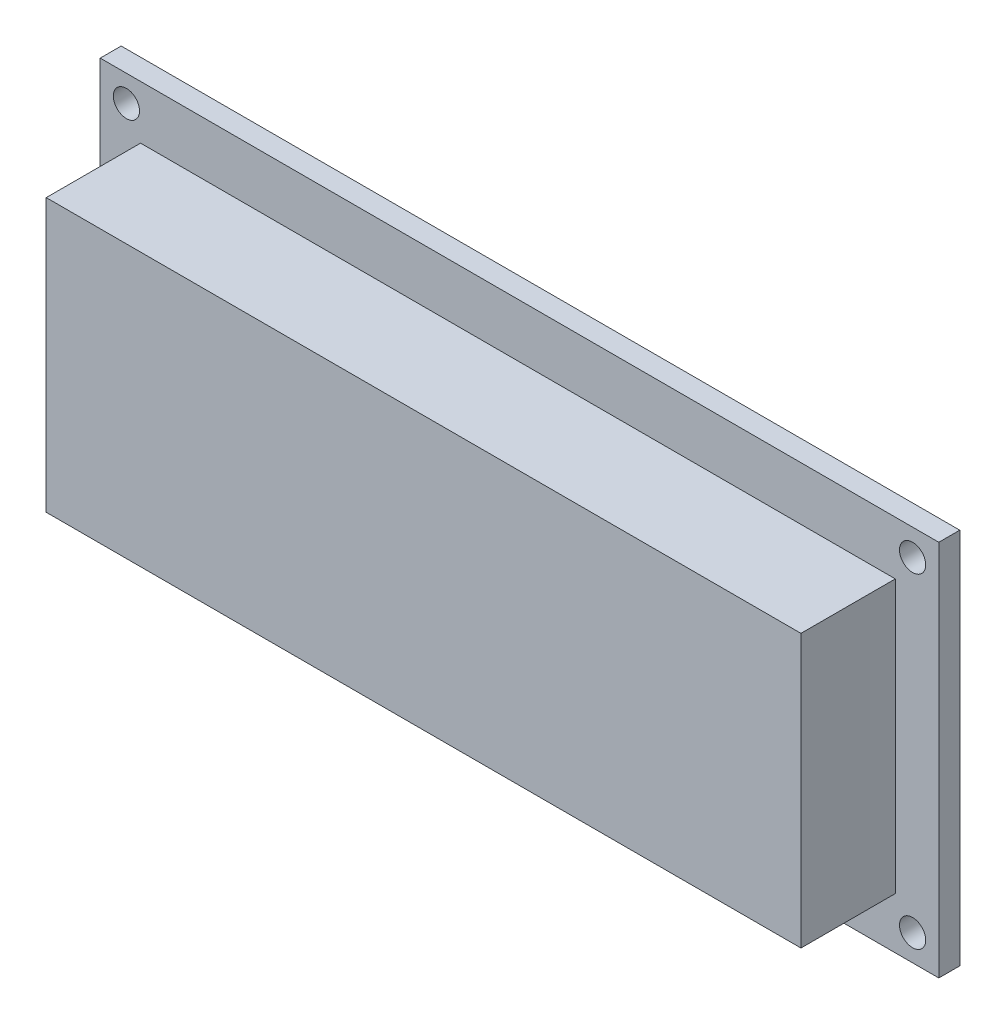
ISO-10303-21;
HEADER;
FILE_DESCRIPTION(('STEP AP214'),'2;1');
FILE_NAME('part.step','',(''),(''),'','','');
FILE_SCHEMA(('AUTOMOTIVE_DESIGN { 1 0 10303 214 1 1 1 1 }'));
ENDSEC;
DATA;
#1=APPLICATION_CONTEXT('core data for automotive mechanical design processes');
#2=APPLICATION_PROTOCOL_DEFINITION('international standard','automotive_design',2000,#1);
#3=PRODUCT_CONTEXT('',#1,'mechanical');
#4=PRODUCT('Part','Part','',(#3));
#5=PRODUCT_RELATED_PRODUCT_CATEGORY('part','',(#4));
#6=PRODUCT_DEFINITION_FORMATION('','',#4);
#7=PRODUCT_DEFINITION_CONTEXT('part definition',#1,'design');
#8=PRODUCT_DEFINITION('design','',#6,#7);
#9=PRODUCT_DEFINITION_SHAPE('','',#8);
#10=(LENGTH_UNIT() NAMED_UNIT(*) SI_UNIT(.MILLI.,.METRE.));
#11=(NAMED_UNIT(*) PLANE_ANGLE_UNIT() SI_UNIT($,.RADIAN.));
#12=(NAMED_UNIT(*) SI_UNIT($,.STERADIAN.) SOLID_ANGLE_UNIT());
#13=UNCERTAINTY_MEASURE_WITH_UNIT(LENGTH_MEASURE(1.E-05),#10,'distance_accuracy_value','');
#14=(GEOMETRIC_REPRESENTATION_CONTEXT(3) GLOBAL_UNCERTAINTY_ASSIGNED_CONTEXT((#13)) GLOBAL_UNIT_ASSIGNED_CONTEXT((#10,
#11,#12)) REPRESENTATION_CONTEXT('',''));
#15=CARTESIAN_POINT('',(0.,0.,0.));
#16=DIRECTION('',(0.,0.,1.));
#17=DIRECTION('',(1.,0.,0.));
#18=AXIS2_PLACEMENT_3D('',#15,#16,#17);
#19=CARTESIAN_POINT('',(0.,0.,2.));
#20=DIRECTION('',(0.,0.,1.));
#21=DIRECTION('',(1.,0.,0.));
#22=AXIS2_PLACEMENT_3D('',#19,#20,#21);
#23=PLANE('',#22);
#24=CARTESIAN_POINT('',(-16.2452195315885,-19.87522160074,2.));
#25=DIRECTION('',(0.,0.,1.));
#26=DIRECTION('',(1.,0.,0.));
#27=AXIS2_PLACEMENT_3D('',#24,#25,#26);
#28=CIRCLE('',#27,1.25);
#29=CARTESIAN_POINT('',(-14.9952195315885,-19.87522160074,2.));
#30=VERTEX_POINT('',#29);
#31=EDGE_CURVE('E222',#30,#30,#28,.T.);
#32=ORIENTED_EDGE('',*,*,#31,.F.);
#33=EDGE_LOOP('',(#32));
#34=FACE_BOUND('',#33,.T.);
#35=CARTESIAN_POINT('',(58.7547804684115,-19.87522160074,2.));
#36=DIRECTION('',(0.,0.,1.));
#37=DIRECTION('',(1.,0.,0.));
#38=AXIS2_PLACEMENT_3D('',#35,#36,#37);
#39=CIRCLE('',#38,1.25);
#40=CARTESIAN_POINT('',(60.0047804684115,-19.87522160074,2.));
#41=VERTEX_POINT('',#40);
#42=EDGE_CURVE('E224',#41,#41,#39,.T.);
#43=ORIENTED_EDGE('',*,*,#42,.F.);
#44=EDGE_LOOP('',(#43));
#45=FACE_BOUND('',#44,.T.);
#46=CARTESIAN_POINT('',(58.7547804684115,11.12477839926,2.));
#47=DIRECTION('',(0.,0.,1.));
#48=DIRECTION('',(1.,0.,0.));
#49=AXIS2_PLACEMENT_3D('',#46,#47,#48);
#50=CIRCLE('',#49,1.25);
#51=CARTESIAN_POINT('',(60.0047804684115,11.12477839926,2.));
#52=VERTEX_POINT('',#51);
#53=EDGE_CURVE('E230',#52,#52,#50,.T.);
#54=ORIENTED_EDGE('',*,*,#53,.F.);
#55=EDGE_LOOP('',(#54));
#56=FACE_BOUND('',#55,.T.);
#57=CARTESIAN_POINT('',(-16.2452195315885,11.12477839926,2.));
#58=DIRECTION('',(0.,0.,1.));
#59=DIRECTION('',(1.,0.,0.));
#60=AXIS2_PLACEMENT_3D('',#57,#58,#59);
#61=CIRCLE('',#60,1.25);
#62=CARTESIAN_POINT('',(-14.9952195315885,11.12477839926,2.));
#63=VERTEX_POINT('',#62);
#64=EDGE_CURVE('E236',#63,#63,#61,.T.);
#65=ORIENTED_EDGE('',*,*,#64,.F.);
#66=EDGE_LOOP('',(#65));
#67=FACE_BOUND('',#66,.T.);
#68=DIRECTION('',(0.,-1.,0.));
#69=VECTOR('',#68,1.);
#70=CARTESIAN_POINT('',(-18.7452195315885,13.62477839926,2.));
#71=LINE('',#70,#69);
#72=CARTESIAN_POINT('',(-18.7452195315885,13.62477839926,2.));
#73=VERTEX_POINT('',#72);
#74=CARTESIAN_POINT('',(-18.7452195315885,-22.37522160074,2.));
#75=VERTEX_POINT('',#74);
#76=EDGE_CURVE('E142',#73,#75,#71,.T.);
#77=ORIENTED_EDGE('',*,*,#76,.T.);
#78=DIRECTION('',(1.,0.,0.));
#79=VECTOR('',#78,1.);
#80=CARTESIAN_POINT('',(-18.7452195315885,-22.37522160074,2.));
#81=LINE('',#80,#79);
#82=CARTESIAN_POINT('',(61.2547804684115,-22.37522160074,2.));
#83=VERTEX_POINT('',#82);
#84=EDGE_CURVE('E87',#75,#83,#81,.T.);
#85=ORIENTED_EDGE('',*,*,#84,.T.);
#86=DIRECTION('',(0.,1.,0.));
#87=VECTOR('',#86,1.);
#88=CARTESIAN_POINT('',(61.2547804684115,13.62477839926,2.));
#89=LINE('',#88,#87);
#90=CARTESIAN_POINT('',(61.2547804684115,13.62477839926,2.));
#91=VERTEX_POINT('',#90);
#92=EDGE_CURVE('E145',#83,#91,#89,.T.);
#93=ORIENTED_EDGE('',*,*,#92,.T.);
#94=DIRECTION('',(-1.,0.,0.));
#95=VECTOR('',#94,1.);
#96=CARTESIAN_POINT('',(-18.7452195315885,13.62477839926,2.));
#97=LINE('',#96,#95);
#98=EDGE_CURVE('E59',#91,#73,#97,.T.);
#99=ORIENTED_EDGE('',*,*,#98,.T.);
#100=EDGE_LOOP('',(#77,#85,#93,#99));
#101=FACE_BOUND('',#100,.T.);
#102=DIRECTION('',(1.,0.,0.));
#103=VECTOR('',#102,1.);
#104=CARTESIAN_POINT('',(-14.8952195315885,-17.47522160074,2.));
#105=LINE('',#104,#103);
#106=CARTESIAN_POINT('',(-14.8952195315885,-17.47522160074,2.));
#107=VERTEX_POINT('',#106);
#108=CARTESIAN_POINT('',(57.1047804684115,-17.47522160074,2.));
#109=VERTEX_POINT('',#108);
#110=EDGE_CURVE('E248',#107,#109,#105,.T.);
#111=ORIENTED_EDGE('',*,*,#110,.F.);
#112=DIRECTION('',(0.,-1.,0.));
#113=VECTOR('',#112,1.);
#114=CARTESIAN_POINT('',(-14.8952195315885,8.52477839925996,2.));
#115=LINE('',#114,#113);
#116=CARTESIAN_POINT('',(-14.8952195315885,8.52477839925996,2.));
#117=VERTEX_POINT('',#116);
#118=EDGE_CURVE('E132',#117,#107,#115,.T.);
#119=ORIENTED_EDGE('',*,*,#118,.F.);
#120=DIRECTION('',(-1.,0.,0.));
#121=VECTOR('',#120,1.);
#122=CARTESIAN_POINT('',(-14.8952195315885,8.52477839925996,2.));
#123=LINE('',#122,#121);
#124=CARTESIAN_POINT('',(57.1047804684115,8.52477839925996,2.));
#125=VERTEX_POINT('',#124);
#126=EDGE_CURVE('E128',#125,#117,#123,.T.);
#127=ORIENTED_EDGE('',*,*,#126,.F.);
#128=DIRECTION('',(0.,1.,0.));
#129=VECTOR('',#128,1.);
#130=CARTESIAN_POINT('',(57.1047804684115,8.52477839925996,2.));
#131=LINE('',#130,#129);
#132=EDGE_CURVE('E250',#109,#125,#131,.T.);
#133=ORIENTED_EDGE('',*,*,#132,.F.);
#134=EDGE_LOOP('',(#111,#119,#127,#133));
#135=FACE_BOUND('',#134,.T.);
#136=ADVANCED_FACE('F35',(#34,#45,#56,#67,#101,#135),#23,.T.);
#137=CARTESIAN_POINT('',(-18.7452195315885,13.62477839926,2.));
#138=DIRECTION('',(1.,0.,0.));
#139=DIRECTION('',(0.,1.,0.));
#140=AXIS2_PLACEMENT_3D('',#137,#138,#139);
#141=PLANE('',#140);
#142=DIRECTION('',(0.,-1.,0.));
#143=VECTOR('',#142,1.);
#144=CARTESIAN_POINT('',(-18.7452195315885,13.62477839926,0.));
#145=LINE('',#144,#143);
#146=CARTESIAN_POINT('',(-18.7452195315885,13.62477839926,0.));
#147=VERTEX_POINT('',#146);
#148=CARTESIAN_POINT('',(-18.7452195315885,-22.37522160074,0.));
#149=VERTEX_POINT('',#148);
#150=EDGE_CURVE('E134',#147,#149,#145,.T.);
#151=ORIENTED_EDGE('',*,*,#150,.T.);
#152=DIRECTION('',(0.,0.,-1.));
#153=VECTOR('',#152,1.);
#154=CARTESIAN_POINT('',(-18.7452195315885,-22.37522160074,2.));
#155=LINE('',#154,#153);
#156=EDGE_CURVE('E11',#75,#149,#155,.T.);
#157=ORIENTED_EDGE('',*,*,#156,.F.);
#158=ORIENTED_EDGE('',*,*,#76,.F.);
#159=DIRECTION('',(0.,0.,-1.));
#160=VECTOR('',#159,1.);
#161=CARTESIAN_POINT('',(-18.7452195315885,13.62477839926,2.));
#162=LINE('',#161,#160);
#163=EDGE_CURVE('E147',#73,#147,#162,.T.);
#164=ORIENTED_EDGE('',*,*,#163,.T.);
#165=EDGE_LOOP('',(#151,#157,#158,#164));
#166=FACE_BOUND('',#165,.T.);
#167=ADVANCED_FACE('F37',(#166),#141,.F.);
#168=CARTESIAN_POINT('',(-18.7452195315885,-22.37522160074,2.));
#169=DIRECTION('',(0.,1.,0.));
#170=DIRECTION('',(0.,0.,1.));
#171=AXIS2_PLACEMENT_3D('',#168,#169,#170);
#172=PLANE('',#171);
#173=DIRECTION('',(1.,0.,0.));
#174=VECTOR('',#173,1.);
#175=CARTESIAN_POINT('',(-18.7452195315885,-22.37522160074,0.));
#176=LINE('',#175,#174);
#177=CARTESIAN_POINT('',(61.2547804684115,-22.37522160074,0.));
#178=VERTEX_POINT('',#177);
#179=EDGE_CURVE('E137',#149,#178,#176,.T.);
#180=ORIENTED_EDGE('',*,*,#179,.T.);
#181=DIRECTION('',(0.,0.,-1.));
#182=VECTOR('',#181,1.);
#183=CARTESIAN_POINT('',(61.2547804684115,-22.37522160074,2.));
#184=LINE('',#183,#182);
#185=EDGE_CURVE('E43',#83,#178,#184,.T.);
#186=ORIENTED_EDGE('',*,*,#185,.F.);
#187=ORIENTED_EDGE('',*,*,#84,.F.);
#188=ORIENTED_EDGE('',*,*,#156,.T.);
#189=EDGE_LOOP('',(#180,#186,#187,#188));
#190=FACE_BOUND('',#189,.T.);
#191=ADVANCED_FACE('F176',(#190),#172,.F.);
#192=CARTESIAN_POINT('',(61.2547804684115,13.62477839926,2.));
#193=DIRECTION('',(-1.,0.,0.));
#194=DIRECTION('',(0.,-1.,0.));
#195=AXIS2_PLACEMENT_3D('',#192,#193,#194);
#196=PLANE('',#195);
#197=DIRECTION('',(0.,1.,0.));
#198=VECTOR('',#197,1.);
#199=CARTESIAN_POINT('',(61.2547804684115,13.62477839926,0.));
#200=LINE('',#199,#198);
#201=CARTESIAN_POINT('',(61.2547804684115,13.62477839926,0.));
#202=VERTEX_POINT('',#201);
#203=EDGE_CURVE('E150',#178,#202,#200,.T.);
#204=ORIENTED_EDGE('',*,*,#203,.T.);
#205=DIRECTION('',(0.,0.,-1.));
#206=VECTOR('',#205,1.);
#207=CARTESIAN_POINT('',(61.2547804684115,13.62477839926,2.));
#208=LINE('',#207,#206);
#209=EDGE_CURVE('E154',#91,#202,#208,.T.);
#210=ORIENTED_EDGE('',*,*,#209,.F.);
#211=ORIENTED_EDGE('',*,*,#92,.F.);
#212=ORIENTED_EDGE('',*,*,#185,.T.);
#213=EDGE_LOOP('',(#204,#210,#211,#212));
#214=FACE_BOUND('',#213,.T.);
#215=ADVANCED_FACE('F159',(#214),#196,.F.);
#216=CARTESIAN_POINT('',(-18.7452195315885,13.62477839926,2.));
#217=DIRECTION('',(0.,-1.,0.));
#218=DIRECTION('',(0.,0.,-1.));
#219=AXIS2_PLACEMENT_3D('',#216,#217,#218);
#220=PLANE('',#219);
#221=DIRECTION('',(-1.,0.,0.));
#222=VECTOR('',#221,1.);
#223=CARTESIAN_POINT('',(-18.7452195315885,13.62477839926,0.));
#224=LINE('',#223,#222);
#225=EDGE_CURVE('E80',#202,#147,#224,.T.);
#226=ORIENTED_EDGE('',*,*,#225,.T.);
#227=ORIENTED_EDGE('',*,*,#163,.F.);
#228=ORIENTED_EDGE('',*,*,#98,.F.);
#229=ORIENTED_EDGE('',*,*,#209,.T.);
#230=EDGE_LOOP('',(#226,#227,#228,#229));
#231=FACE_BOUND('',#230,.T.);
#232=ADVANCED_FACE('F167',(#231),#220,.F.);
#233=CARTESIAN_POINT('',(0.,0.,0.));
#234=DIRECTION('',(0.,0.,1.));
#235=DIRECTION('',(1.,0.,0.));
#236=AXIS2_PLACEMENT_3D('',#233,#234,#235);
#237=PLANE('',#236);
#238=CARTESIAN_POINT('',(-16.2452195315885,-19.87522160074,0.));
#239=DIRECTION('',(0.,0.,1.));
#240=DIRECTION('',(1.,0.,0.));
#241=AXIS2_PLACEMENT_3D('',#238,#239,#240);
#242=CIRCLE('',#241,1.25);
#243=CARTESIAN_POINT('',(-14.9952195315885,-19.87522160074,0.));
#244=VERTEX_POINT('',#243);
#245=EDGE_CURVE('E220',#244,#244,#242,.T.);
#246=ORIENTED_EDGE('',*,*,#245,.T.);
#247=EDGE_LOOP('',(#246));
#248=FACE_BOUND('',#247,.T.);
#249=CARTESIAN_POINT('',(58.7547804684115,-19.87522160074,0.));
#250=DIRECTION('',(0.,0.,1.));
#251=DIRECTION('',(1.,0.,0.));
#252=AXIS2_PLACEMENT_3D('',#249,#250,#251);
#253=CIRCLE('',#252,1.25);
#254=CARTESIAN_POINT('',(60.0047804684115,-19.87522160074,0.));
#255=VERTEX_POINT('',#254);
#256=EDGE_CURVE('E227',#255,#255,#253,.T.);
#257=ORIENTED_EDGE('',*,*,#256,.T.);
#258=EDGE_LOOP('',(#257));
#259=FACE_BOUND('',#258,.T.);
#260=CARTESIAN_POINT('',(58.7547804684115,11.12477839926,0.));
#261=DIRECTION('',(0.,0.,1.));
#262=DIRECTION('',(1.,0.,0.));
#263=AXIS2_PLACEMENT_3D('',#260,#261,#262);
#264=CIRCLE('',#263,1.25);
#265=CARTESIAN_POINT('',(60.0047804684115,11.12477839926,0.));
#266=VERTEX_POINT('',#265);
#267=EDGE_CURVE('E233',#266,#266,#264,.T.);
#268=ORIENTED_EDGE('',*,*,#267,.T.);
#269=EDGE_LOOP('',(#268));
#270=FACE_BOUND('',#269,.T.);
#271=CARTESIAN_POINT('',(-16.2452195315885,11.12477839926,0.));
#272=DIRECTION('',(0.,0.,1.));
#273=DIRECTION('',(1.,0.,0.));
#274=AXIS2_PLACEMENT_3D('',#271,#272,#273);
#275=CIRCLE('',#274,1.25);
#276=CARTESIAN_POINT('',(-14.9952195315885,11.12477839926,0.));
#277=VERTEX_POINT('',#276);
#278=EDGE_CURVE('E239',#277,#277,#275,.T.);
#279=ORIENTED_EDGE('',*,*,#278,.T.);
#280=EDGE_LOOP('',(#279));
#281=FACE_BOUND('',#280,.T.);
#282=ORIENTED_EDGE('',*,*,#150,.F.);
#283=ORIENTED_EDGE('',*,*,#225,.F.);
#284=ORIENTED_EDGE('',*,*,#203,.F.);
#285=ORIENTED_EDGE('',*,*,#179,.F.);
#286=EDGE_LOOP('',(#282,#283,#284,#285));
#287=FACE_BOUND('',#286,.T.);
#288=ADVANCED_FACE('F163',(#248,#259,#270,#281,#287),#237,.F.);
#289=CARTESIAN_POINT('',(-14.8952195315885,8.52477839925996,11.));
#290=DIRECTION('',(1.,0.,0.));
#291=DIRECTION('',(0.,1.,0.));
#292=AXIS2_PLACEMENT_3D('',#289,#290,#291);
#293=PLANE('',#292);
#294=ORIENTED_EDGE('',*,*,#118,.T.);
#295=DIRECTION('',(0.,0.,-1.));
#296=VECTOR('',#295,1.);
#297=CARTESIAN_POINT('',(-14.8952195315885,-17.47522160074,11.));
#298=LINE('',#297,#296);
#299=CARTESIAN_POINT('',(-14.8952195315885,-17.47522160074,11.));
#300=VERTEX_POINT('',#299);
#301=EDGE_CURVE('E113',#300,#107,#298,.T.);
#302=ORIENTED_EDGE('',*,*,#301,.F.);
#303=DIRECTION('',(0.,-1.,0.));
#304=VECTOR('',#303,1.);
#305=CARTESIAN_POINT('',(-14.8952195315885,8.52477839925996,11.));
#306=LINE('',#305,#304);
#307=CARTESIAN_POINT('',(-14.8952195315885,8.52477839925996,11.));
#308=VERTEX_POINT('',#307);
#309=EDGE_CURVE('E120',#308,#300,#306,.T.);
#310=ORIENTED_EDGE('',*,*,#309,.F.);
#311=DIRECTION('',(0.,0.,-1.));
#312=VECTOR('',#311,1.);
#313=CARTESIAN_POINT('',(-14.8952195315885,8.52477839925996,11.));
#314=LINE('',#313,#312);
#315=EDGE_CURVE('E246',#308,#117,#314,.T.);
#316=ORIENTED_EDGE('',*,*,#315,.T.);
#317=EDGE_LOOP('',(#294,#302,#310,#316));
#318=FACE_BOUND('',#317,.T.);
#319=ADVANCED_FACE('F130',(#318),#293,.F.);
#320=CARTESIAN_POINT('',(-14.8952195315885,-17.47522160074,11.));
#321=DIRECTION('',(0.,1.,0.));
#322=DIRECTION('',(0.,0.,1.));
#323=AXIS2_PLACEMENT_3D('',#320,#321,#322);
#324=PLANE('',#323);
#325=ORIENTED_EDGE('',*,*,#110,.T.);
#326=DIRECTION('',(0.,0.,-1.));
#327=VECTOR('',#326,1.);
#328=CARTESIAN_POINT('',(57.1047804684115,-17.47522160074,11.));
#329=LINE('',#328,#327);
#330=CARTESIAN_POINT('',(57.1047804684115,-17.47522160074,11.));
#331=VERTEX_POINT('',#330);
#332=EDGE_CURVE('E116',#331,#109,#329,.T.);
#333=ORIENTED_EDGE('',*,*,#332,.F.);
#334=DIRECTION('',(1.,0.,0.));
#335=VECTOR('',#334,1.);
#336=CARTESIAN_POINT('',(-14.8952195315885,-17.47522160074,11.));
#337=LINE('',#336,#335);
#338=EDGE_CURVE('E109',#300,#331,#337,.T.);
#339=ORIENTED_EDGE('',*,*,#338,.F.);
#340=ORIENTED_EDGE('',*,*,#301,.T.);
#341=EDGE_LOOP('',(#325,#333,#339,#340));
#342=FACE_BOUND('',#341,.T.);
#343=ADVANCED_FACE('F111',(#342),#324,.F.);
#344=CARTESIAN_POINT('',(57.1047804684115,8.52477839925996,11.));
#345=DIRECTION('',(-1.,0.,0.));
#346=DIRECTION('',(0.,-1.,0.));
#347=AXIS2_PLACEMENT_3D('',#344,#345,#346);
#348=PLANE('',#347);
#349=ORIENTED_EDGE('',*,*,#132,.T.);
#350=DIRECTION('',(0.,0.,-1.));
#351=VECTOR('',#350,1.);
#352=CARTESIAN_POINT('',(57.1047804684115,8.52477839925996,11.));
#353=LINE('',#352,#351);
#354=CARTESIAN_POINT('',(57.1047804684115,8.52477839925996,11.));
#355=VERTEX_POINT('',#354);
#356=EDGE_CURVE('E50',#355,#125,#353,.T.);
#357=ORIENTED_EDGE('',*,*,#356,.F.);
#358=DIRECTION('',(0.,1.,0.));
#359=VECTOR('',#358,1.);
#360=CARTESIAN_POINT('',(57.1047804684115,8.52477839925996,11.));
#361=LINE('',#360,#359);
#362=EDGE_CURVE('E119',#331,#355,#361,.T.);
#363=ORIENTED_EDGE('',*,*,#362,.F.);
#364=ORIENTED_EDGE('',*,*,#332,.T.);
#365=EDGE_LOOP('',(#349,#357,#363,#364));
#366=FACE_BOUND('',#365,.T.);
#367=ADVANCED_FACE('F191',(#366),#348,.F.);
#368=CARTESIAN_POINT('',(-14.8952195315885,8.52477839925996,11.));
#369=DIRECTION('',(0.,-1.,0.));
#370=DIRECTION('',(1.,0.,0.));
#371=AXIS2_PLACEMENT_3D('',#368,#369,#370);
#372=PLANE('',#371);
#373=ORIENTED_EDGE('',*,*,#126,.T.);
#374=ORIENTED_EDGE('',*,*,#315,.F.);
#375=DIRECTION('',(-1.,0.,0.));
#376=VECTOR('',#375,1.);
#377=CARTESIAN_POINT('',(-14.8952195315885,8.52477839925996,11.));
#378=LINE('',#377,#376);
#379=EDGE_CURVE('E124',#355,#308,#378,.T.);
#380=ORIENTED_EDGE('',*,*,#379,.F.);
#381=ORIENTED_EDGE('',*,*,#356,.T.);
#382=EDGE_LOOP('',(#373,#374,#380,#381));
#383=FACE_BOUND('',#382,.T.);
#384=ADVANCED_FACE('F194',(#383),#372,.F.);
#385=CARTESIAN_POINT('',(0.,0.,11.));
#386=DIRECTION('',(0.,0.,1.));
#387=DIRECTION('',(1.,0.,0.));
#388=AXIS2_PLACEMENT_3D('',#385,#386,#387);
#389=PLANE('',#388);
#390=ORIENTED_EDGE('',*,*,#309,.T.);
#391=ORIENTED_EDGE('',*,*,#338,.T.);
#392=ORIENTED_EDGE('',*,*,#362,.T.);
#393=ORIENTED_EDGE('',*,*,#379,.T.);
#394=EDGE_LOOP('',(#390,#391,#392,#393));
#395=FACE_BOUND('',#394,.T.);
#396=ADVANCED_FACE('F123',(#395),#389,.T.);
#397=CARTESIAN_POINT('',(-16.2452195315885,11.12477839926,0.));
#398=DIRECTION('',(0.,0.,1.));
#399=DIRECTION('',(1.,0.,0.));
#400=AXIS2_PLACEMENT_3D('',#397,#398,#399);
#401=CYLINDRICAL_SURFACE('',#400,1.25);
#402=ORIENTED_EDGE('',*,*,#278,.F.);
#403=EDGE_LOOP('',(#402));
#404=FACE_BOUND('',#403,.T.);
#405=ORIENTED_EDGE('',*,*,#64,.T.);
#406=EDGE_LOOP('',(#405));
#407=FACE_BOUND('',#406,.T.);
#408=ADVANCED_FACE('F200',(#404,#407),#401,.F.);
#409=CARTESIAN_POINT('',(58.7547804684115,11.12477839926,0.));
#410=DIRECTION('',(0.,0.,1.));
#411=DIRECTION('',(1.,0.,0.));
#412=AXIS2_PLACEMENT_3D('',#409,#410,#411);
#413=CYLINDRICAL_SURFACE('',#412,1.25);
#414=ORIENTED_EDGE('',*,*,#267,.F.);
#415=EDGE_LOOP('',(#414));
#416=FACE_BOUND('',#415,.T.);
#417=ORIENTED_EDGE('',*,*,#53,.T.);
#418=EDGE_LOOP('',(#417));
#419=FACE_BOUND('',#418,.T.);
#420=ADVANCED_FACE('F203',(#416,#419),#413,.F.);
#421=CARTESIAN_POINT('',(58.7547804684115,-19.87522160074,0.));
#422=DIRECTION('',(0.,0.,1.));
#423=DIRECTION('',(1.,0.,0.));
#424=AXIS2_PLACEMENT_3D('',#421,#422,#423);
#425=CYLINDRICAL_SURFACE('',#424,1.25);
#426=ORIENTED_EDGE('',*,*,#256,.F.);
#427=EDGE_LOOP('',(#426));
#428=FACE_BOUND('',#427,.T.);
#429=ORIENTED_EDGE('',*,*,#42,.T.);
#430=EDGE_LOOP('',(#429));
#431=FACE_BOUND('',#430,.T.);
#432=ADVANCED_FACE('F207',(#428,#431),#425,.F.);
#433=CARTESIAN_POINT('',(-16.2452195315885,-19.87522160074,0.));
#434=DIRECTION('',(0.,0.,1.));
#435=DIRECTION('',(1.,0.,0.));
#436=AXIS2_PLACEMENT_3D('',#433,#434,#435);
#437=CYLINDRICAL_SURFACE('',#436,1.25);
#438=ORIENTED_EDGE('',*,*,#245,.F.);
#439=EDGE_LOOP('',(#438));
#440=FACE_BOUND('',#439,.T.);
#441=ORIENTED_EDGE('',*,*,#31,.T.);
#442=EDGE_LOOP('',(#441));
#443=FACE_BOUND('',#442,.T.);
#444=ADVANCED_FACE('F211',(#440,#443),#437,.F.);
#445=CLOSED_SHELL('',(#136,#167,#191,#215,#232,#288,#319,#343,#367,#384,#396,#408,#420,#432,#444));
#446=MANIFOLD_SOLID_BREP('B2',#445);
#447=ADVANCED_BREP_SHAPE_REPRESENTATION('',(#18,#446),#14);
#448=SHAPE_DEFINITION_REPRESENTATION(#9,#447);
ENDSEC;
END-ISO-10303-21;
